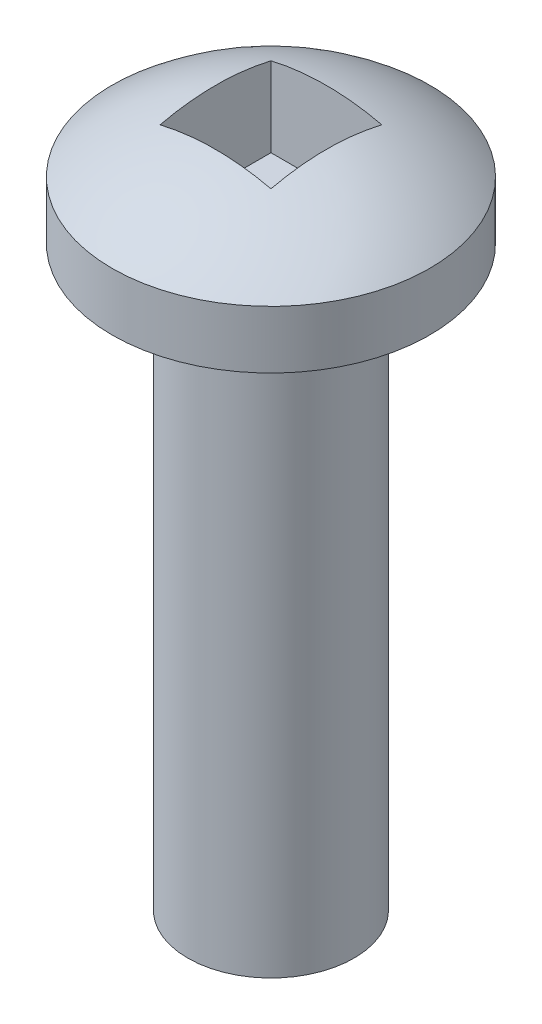
ISO-10303-21;
HEADER;
FILE_DESCRIPTION(('STEP AP214'),'2;1');
FILE_NAME('part.step','',(''),(''),'','','');
FILE_SCHEMA(('AUTOMOTIVE_DESIGN { 1 0 10303 214 1 1 1 1 }'));
ENDSEC;
DATA;
#1=APPLICATION_CONTEXT('core data for automotive mechanical design processes');
#2=APPLICATION_PROTOCOL_DEFINITION('international standard','automotive_design',2000,#1);
#3=PRODUCT_CONTEXT('',#1,'mechanical');
#4=PRODUCT('Part','Part','',(#3));
#5=PRODUCT_RELATED_PRODUCT_CATEGORY('part','',(#4));
#6=PRODUCT_DEFINITION_FORMATION('','',#4);
#7=PRODUCT_DEFINITION_CONTEXT('part definition',#1,'design');
#8=PRODUCT_DEFINITION('design','',#6,#7);
#9=PRODUCT_DEFINITION_SHAPE('','',#8);
#10=(LENGTH_UNIT() NAMED_UNIT(*) SI_UNIT(.MILLI.,.METRE.));
#11=(NAMED_UNIT(*) PLANE_ANGLE_UNIT() SI_UNIT($,.RADIAN.));
#12=(NAMED_UNIT(*) SI_UNIT($,.STERADIAN.) SOLID_ANGLE_UNIT());
#13=UNCERTAINTY_MEASURE_WITH_UNIT(LENGTH_MEASURE(1.E-05),#10,'distance_accuracy_value','');
#14=(GEOMETRIC_REPRESENTATION_CONTEXT(3) GLOBAL_UNCERTAINTY_ASSIGNED_CONTEXT((#13)) GLOBAL_UNIT_ASSIGNED_CONTEXT((#10,
#11,#12)) REPRESENTATION_CONTEXT('',''));
#15=CARTESIAN_POINT('',(0.,0.,0.));
#16=DIRECTION('',(0.,0.,1.));
#17=DIRECTION('',(1.,0.,0.));
#18=AXIS2_PLACEMENT_3D('',#15,#16,#17);
#19=CARTESIAN_POINT('',(0.,-12.7,0.));
#20=DIRECTION('',(0.,1.,0.));
#21=DIRECTION('',(0.,0.,1.));
#22=AXIS2_PLACEMENT_3D('',#19,#20,#21);
#23=CYLINDRICAL_SURFACE('',#22,1.8288);
#24=CARTESIAN_POINT('',(0.,-12.7,0.));
#25=DIRECTION('',(0.,1.,0.));
#26=DIRECTION('',(0.,0.,1.));
#27=AXIS2_PLACEMENT_3D('',#24,#25,#26);
#28=CIRCLE('',#27,1.8288);
#29=CARTESIAN_POINT('',(0.,-12.7,1.8288));
#30=VERTEX_POINT('',#29);
#31=EDGE_CURVE('E104',#30,#30,#28,.T.);
#32=ORIENTED_EDGE('',*,*,#31,.T.);
#33=EDGE_LOOP('',(#32));
#34=FACE_BOUND('',#33,.T.);
#35=CARTESIAN_POINT('',(0.,0.,0.));
#36=DIRECTION('',(0.,1.,0.));
#37=DIRECTION('',(0.,0.,1.));
#38=AXIS2_PLACEMENT_3D('',#35,#36,#37);
#39=CIRCLE('',#38,1.8288);
#40=CARTESIAN_POINT('',(0.,0.,1.8288));
#41=VERTEX_POINT('',#40);
#42=EDGE_CURVE('E108',#41,#41,#39,.T.);
#43=ORIENTED_EDGE('',*,*,#42,.F.);
#44=EDGE_LOOP('',(#43));
#45=FACE_BOUND('',#44,.T.);
#46=ADVANCED_FACE('F32',(#34,#45),#23,.T.);
#47=CARTESIAN_POINT('',(0.,-12.7,0.));
#48=DIRECTION('',(0.,1.,0.));
#49=DIRECTION('',(0.,0.,1.));
#50=AXIS2_PLACEMENT_3D('',#47,#48,#49);
#51=PLANE('',#50);
#52=ORIENTED_EDGE('',*,*,#31,.F.);
#53=EDGE_LOOP('',(#52));
#54=FACE_BOUND('',#53,.T.);
#55=ADVANCED_FACE('F128',(#54),#51,.F.);
#56=CARTESIAN_POINT('',(0.,1.27,0.));
#57=DIRECTION('',(0.,-1.,0.));
#58=DIRECTION('',(0.,0.,-1.));
#59=AXIS2_PLACEMENT_3D('',#56,#57,#58);
#60=CYLINDRICAL_SURFACE('',#59,3.4925);
#61=CARTESIAN_POINT('',(0.,1.27,0.));
#62=DIRECTION('',(0.,1.,0.));
#63=DIRECTION('',(0.,0.,1.));
#64=AXIS2_PLACEMENT_3D('',#61,#62,#63);
#65=CIRCLE('',#64,3.4925);
#66=CARTESIAN_POINT('',(0.,1.27,3.4925));
#67=VERTEX_POINT('',#66);
#68=EDGE_CURVE('E103',#67,#67,#65,.T.);
#69=ORIENTED_EDGE('',*,*,#68,.F.);
#70=EDGE_LOOP('',(#69));
#71=FACE_BOUND('',#70,.T.);
#72=CARTESIAN_POINT('',(0.,0.,0.));
#73=DIRECTION('',(0.,1.,0.));
#74=DIRECTION('',(0.,0.,1.));
#75=AXIS2_PLACEMENT_3D('',#72,#73,#74);
#76=CIRCLE('',#75,3.4925);
#77=CARTESIAN_POINT('',(0.,0.,3.4925));
#78=VERTEX_POINT('',#77);
#79=EDGE_CURVE('E97',#78,#78,#76,.T.);
#80=ORIENTED_EDGE('',*,*,#79,.T.);
#81=EDGE_LOOP('',(#80));
#82=FACE_BOUND('',#81,.T.);
#83=ADVANCED_FACE('F123',(#71,#82),#60,.T.);
#84=CARTESIAN_POINT('',(0.,-2.8971875,0.));
#85=DIRECTION('',(0.,0.,1.));
#86=DIRECTION('',(1.,0.,0.));
#87=AXIS2_PLACEMENT_3D('',#84,#85,#86);
#88=SPHERICAL_SURFACE('',#87,5.4371875);
#89=CARTESIAN_POINT('',(1.2192,-2.8971875,0.));
#90=DIRECTION('',(1.,0.,0.));
#91=DIRECTION('',(0.,0.,-1.));
#92=AXIS2_PLACEMENT_3D('',#89,#90,#91);
#93=CIRCLE('',#92,5.29873185490229);
#94=CARTESIAN_POINT('',(1.2192,2.25937246088053,1.2192));
#95=VERTEX_POINT('',#94);
#96=CARTESIAN_POINT('',(1.2192,2.25937246088053,-1.2192));
#97=VERTEX_POINT('',#96);
#98=EDGE_CURVE('E11',#95,#97,#93,.F.);
#99=ORIENTED_EDGE('',*,*,#98,.F.);
#100=CARTESIAN_POINT('',(0.,-2.8971875,1.2192));
#101=DIRECTION('',(0.,0.,1.));
#102=DIRECTION('',(1.,0.,0.));
#103=AXIS2_PLACEMENT_3D('',#100,#101,#102);
#104=CIRCLE('',#103,5.29873185490229);
#105=CARTESIAN_POINT('',(-1.2192,2.25937246088053,1.2192));
#106=VERTEX_POINT('',#105);
#107=EDGE_CURVE('E40',#106,#95,#104,.F.);
#108=ORIENTED_EDGE('',*,*,#107,.F.);
#109=CARTESIAN_POINT('',(-1.2192,-2.8971875,0.));
#110=DIRECTION('',(-1.,0.,0.));
#111=DIRECTION('',(0.,0.,1.));
#112=AXIS2_PLACEMENT_3D('',#109,#110,#111);
#113=CIRCLE('',#112,5.29873185490229);
#114=CARTESIAN_POINT('',(-1.2192,2.25937246088053,-1.2192));
#115=VERTEX_POINT('',#114);
#116=EDGE_CURVE('E114',#115,#106,#113,.F.);
#117=ORIENTED_EDGE('',*,*,#116,.F.);
#118=CARTESIAN_POINT('',(0.,-2.8971875,-1.2192));
#119=DIRECTION('',(0.,0.,-1.));
#120=DIRECTION('',(-1.,0.,0.));
#121=AXIS2_PLACEMENT_3D('',#118,#119,#120);
#122=CIRCLE('',#121,5.29873185490229);
#123=EDGE_CURVE('E107',#97,#115,#122,.F.);
#124=ORIENTED_EDGE('',*,*,#123,.F.);
#125=EDGE_LOOP('',(#99,#108,#117,#124));
#126=FACE_BOUND('',#125,.T.);
#127=ORIENTED_EDGE('',*,*,#68,.T.);
#128=EDGE_LOOP('',(#127));
#129=FACE_BOUND('',#128,.T.);
#130=ADVANCED_FACE('F34',(#126,#129),#88,.T.);
#131=CARTESIAN_POINT('',(0.,0.,0.));
#132=DIRECTION('',(0.,1.,0.));
#133=DIRECTION('',(0.,0.,1.));
#134=AXIS2_PLACEMENT_3D('',#131,#132,#133);
#135=PLANE('',#134);
#136=ORIENTED_EDGE('',*,*,#42,.T.);
#137=EDGE_LOOP('',(#136));
#138=FACE_BOUND('',#137,.T.);
#139=ORIENTED_EDGE('',*,*,#79,.F.);
#140=EDGE_LOOP('',(#139));
#141=FACE_BOUND('',#140,.T.);
#142=ADVANCED_FACE('F122',(#138,#141),#135,.F.);
#143=CARTESIAN_POINT('',(1.2192,0.508,1.2192));
#144=DIRECTION('',(1.,0.,0.));
#145=DIRECTION('',(0.,0.,-1.));
#146=AXIS2_PLACEMENT_3D('',#143,#144,#145);
#147=PLANE('',#146);
#148=ORIENTED_EDGE('',*,*,#98,.T.);
#149=DIRECTION('',(0.,1.,0.));
#150=VECTOR('',#149,1.);
#151=CARTESIAN_POINT('',(1.2192,0.508,-1.2192));
#152=LINE('',#151,#150);
#153=CARTESIAN_POINT('',(1.2192,0.508,-1.2192));
#154=VERTEX_POINT('',#153);
#155=EDGE_CURVE('E47',#154,#97,#152,.T.);
#156=ORIENTED_EDGE('',*,*,#155,.F.);
#157=DIRECTION('',(0.,0.,-1.));
#158=VECTOR('',#157,1.);
#159=CARTESIAN_POINT('',(1.2192,0.508,1.2192));
#160=LINE('',#159,#158);
#161=CARTESIAN_POINT('',(1.2192,0.508,1.2192));
#162=VERTEX_POINT('',#161);
#163=EDGE_CURVE('E73',#162,#154,#160,.T.);
#164=ORIENTED_EDGE('',*,*,#163,.F.);
#165=DIRECTION('',(0.,1.,0.));
#166=VECTOR('',#165,1.);
#167=CARTESIAN_POINT('',(1.2192,0.508,1.2192));
#168=LINE('',#167,#166);
#169=EDGE_CURVE('E95',#162,#95,#168,.T.);
#170=ORIENTED_EDGE('',*,*,#169,.T.);
#171=EDGE_LOOP('',(#148,#156,#164,#170));
#172=FACE_BOUND('',#171,.T.);
#173=ADVANCED_FACE('F71',(#172),#147,.F.);
#174=CARTESIAN_POINT('',(-1.2192,0.508,1.2192));
#175=DIRECTION('',(0.,0.,1.));
#176=DIRECTION('',(1.,0.,0.));
#177=AXIS2_PLACEMENT_3D('',#174,#175,#176);
#178=PLANE('',#177);
#179=ORIENTED_EDGE('',*,*,#107,.T.);
#180=ORIENTED_EDGE('',*,*,#169,.F.);
#181=DIRECTION('',(1.,0.,0.));
#182=VECTOR('',#181,1.);
#183=CARTESIAN_POINT('',(-1.2192,0.508,1.2192));
#184=LINE('',#183,#182);
#185=CARTESIAN_POINT('',(-1.2192,0.508,1.2192));
#186=VERTEX_POINT('',#185);
#187=EDGE_CURVE('E78',#186,#162,#184,.T.);
#188=ORIENTED_EDGE('',*,*,#187,.F.);
#189=DIRECTION('',(0.,1.,0.));
#190=VECTOR('',#189,1.);
#191=CARTESIAN_POINT('',(-1.2192,0.508,1.2192));
#192=LINE('',#191,#190);
#193=EDGE_CURVE('E98',#186,#106,#192,.T.);
#194=ORIENTED_EDGE('',*,*,#193,.T.);
#195=EDGE_LOOP('',(#179,#180,#188,#194));
#196=FACE_BOUND('',#195,.T.);
#197=ADVANCED_FACE('F119',(#196),#178,.F.);
#198=CARTESIAN_POINT('',(-1.2192,0.508,1.2192));
#199=DIRECTION('',(-1.,0.,0.));
#200=DIRECTION('',(0.,0.,1.));
#201=AXIS2_PLACEMENT_3D('',#198,#199,#200);
#202=PLANE('',#201);
#203=ORIENTED_EDGE('',*,*,#116,.T.);
#204=ORIENTED_EDGE('',*,*,#193,.F.);
#205=DIRECTION('',(0.,0.,1.));
#206=VECTOR('',#205,1.);
#207=CARTESIAN_POINT('',(-1.2192,0.508,1.2192));
#208=LINE('',#207,#206);
#209=CARTESIAN_POINT('',(-1.2192,0.508,-1.2192));
#210=VERTEX_POINT('',#209);
#211=EDGE_CURVE('E87',#210,#186,#208,.T.);
#212=ORIENTED_EDGE('',*,*,#211,.F.);
#213=DIRECTION('',(0.,1.,0.));
#214=VECTOR('',#213,1.);
#215=CARTESIAN_POINT('',(-1.2192,0.508,-1.2192));
#216=LINE('',#215,#214);
#217=EDGE_CURVE('E77',#210,#115,#216,.T.);
#218=ORIENTED_EDGE('',*,*,#217,.T.);
#219=EDGE_LOOP('',(#203,#204,#212,#218));
#220=FACE_BOUND('',#219,.T.);
#221=ADVANCED_FACE('F117',(#220),#202,.F.);
#222=CARTESIAN_POINT('',(-1.2192,0.508,-1.2192));
#223=DIRECTION('',(0.,0.,-1.));
#224=DIRECTION('',(-1.,0.,0.));
#225=AXIS2_PLACEMENT_3D('',#222,#223,#224);
#226=PLANE('',#225);
#227=ORIENTED_EDGE('',*,*,#123,.T.);
#228=ORIENTED_EDGE('',*,*,#217,.F.);
#229=DIRECTION('',(-1.,0.,0.));
#230=VECTOR('',#229,1.);
#231=CARTESIAN_POINT('',(-1.2192,0.508,-1.2192));
#232=LINE('',#231,#230);
#233=EDGE_CURVE('E81',#154,#210,#232,.T.);
#234=ORIENTED_EDGE('',*,*,#233,.F.);
#235=ORIENTED_EDGE('',*,*,#155,.T.);
#236=EDGE_LOOP('',(#227,#228,#234,#235));
#237=FACE_BOUND('',#236,.T.);
#238=ADVANCED_FACE('F82',(#237),#226,.F.);
#239=CARTESIAN_POINT('',(0.,0.508,0.));
#240=DIRECTION('',(0.,-1.,0.));
#241=DIRECTION('',(0.,0.,-1.));
#242=AXIS2_PLACEMENT_3D('',#239,#240,#241);
#243=PLANE('',#242);
#244=ORIENTED_EDGE('',*,*,#163,.T.);
#245=ORIENTED_EDGE('',*,*,#233,.T.);
#246=ORIENTED_EDGE('',*,*,#211,.T.);
#247=ORIENTED_EDGE('',*,*,#187,.T.);
#248=EDGE_LOOP('',(#244,#245,#246,#247));
#249=FACE_BOUND('',#248,.T.);
#250=ADVANCED_FACE('F89',(#249),#243,.F.);
#251=CLOSED_SHELL('',(#46,#55,#83,#130,#142,#173,#197,#221,#238,#250));
#252=MANIFOLD_SOLID_BREP('B2',#251);
#253=ADVANCED_BREP_SHAPE_REPRESENTATION('',(#18,#252),#14);
#254=SHAPE_DEFINITION_REPRESENTATION(#9,#253);
ENDSEC;
END-ISO-10303-21;
